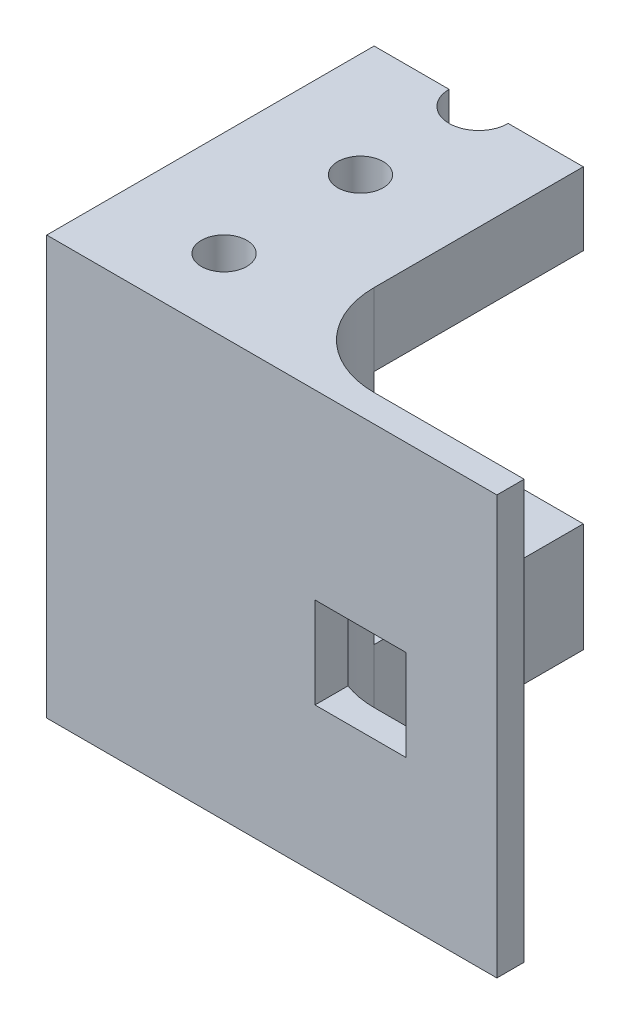
ISO-10303-21;
HEADER;
FILE_DESCRIPTION(('STEP AP214'),'2;1');
FILE_NAME('part.step','',(''),(''),'','','');
FILE_SCHEMA(('AUTOMOTIVE_DESIGN { 1 0 10303 214 1 1 1 1 }'));
ENDSEC;
DATA;
#1=APPLICATION_CONTEXT('core data for automotive mechanical design processes');
#2=APPLICATION_PROTOCOL_DEFINITION('international standard','automotive_design',2000,#1);
#3=PRODUCT_CONTEXT('',#1,'mechanical');
#4=PRODUCT('Part','Part','',(#3));
#5=PRODUCT_RELATED_PRODUCT_CATEGORY('part','',(#4));
#6=PRODUCT_DEFINITION_FORMATION('','',#4);
#7=PRODUCT_DEFINITION_CONTEXT('part definition',#1,'design');
#8=PRODUCT_DEFINITION('design','',#6,#7);
#9=PRODUCT_DEFINITION_SHAPE('','',#8);
#10=(LENGTH_UNIT() NAMED_UNIT(*) SI_UNIT(.MILLI.,.METRE.));
#11=(NAMED_UNIT(*) PLANE_ANGLE_UNIT() SI_UNIT($,.RADIAN.));
#12=(NAMED_UNIT(*) SI_UNIT($,.STERADIAN.) SOLID_ANGLE_UNIT());
#13=UNCERTAINTY_MEASURE_WITH_UNIT(LENGTH_MEASURE(1.E-05),#10,'distance_accuracy_value','');
#14=(GEOMETRIC_REPRESENTATION_CONTEXT(3) GLOBAL_UNCERTAINTY_ASSIGNED_CONTEXT((#13)) GLOBAL_UNIT_ASSIGNED_CONTEXT((#10,
#11,#12)) REPRESENTATION_CONTEXT('',''));
#15=CARTESIAN_POINT('',(0.,0.,0.));
#16=DIRECTION('',(0.,0.,1.));
#17=DIRECTION('',(1.,0.,0.));
#18=AXIS2_PLACEMENT_3D('',#15,#16,#17);
#19=CARTESIAN_POINT('',(11.5,46.,-16.5));
#20=DIRECTION('',(-1.,0.,0.));
#21=DIRECTION('',(0.,0.,1.));
#22=AXIS2_PLACEMENT_3D('',#19,#20,#21);
#23=PLANE('',#22);
#24=DIRECTION('',(0.,0.,-1.));
#25=VECTOR('',#24,1.);
#26=CARTESIAN_POINT('',(11.5,46.,-16.5));
#27=LINE('',#26,#25);
#28=CARTESIAN_POINT('',(11.5,46.,6.5));
#29=VERTEX_POINT('',#28);
#30=CARTESIAN_POINT('',(11.5,46.,-16.5));
#31=VERTEX_POINT('',#30);
#32=EDGE_CURVE('E289',#29,#31,#27,.T.);
#33=ORIENTED_EDGE('',*,*,#32,.F.);
#34=DIRECTION('',(0.,-1.,0.));
#35=VECTOR('',#34,1.);
#36=CARTESIAN_POINT('',(11.5,46.,6.5));
#37=LINE('',#36,#35);
#38=CARTESIAN_POINT('',(11.5,38.,6.50000000000002));
#39=VERTEX_POINT('',#38);
#40=EDGE_CURVE('E251',#29,#39,#37,.T.);
#41=ORIENTED_EDGE('',*,*,#40,.T.);
#42=DIRECTION('',(0.,0.,-1.));
#43=VECTOR('',#42,1.);
#44=CARTESIAN_POINT('',(11.5,38.,-16.5));
#45=LINE('',#44,#43);
#46=CARTESIAN_POINT('',(11.5,38.,-16.5));
#47=VERTEX_POINT('',#46);
#48=EDGE_CURVE('E463',#39,#47,#45,.T.);
#49=ORIENTED_EDGE('',*,*,#48,.T.);
#50=DIRECTION('',(0.,-1.,0.));
#51=VECTOR('',#50,1.);
#52=CARTESIAN_POINT('',(11.5,46.,-16.5));
#53=LINE('',#52,#51);
#54=EDGE_CURVE('E298',#31,#47,#53,.T.);
#55=ORIENTED_EDGE('',*,*,#54,.F.);
#56=EDGE_LOOP('',(#33,#41,#49,#55));
#57=FACE_BOUND('',#56,.T.);
#58=ADVANCED_FACE('F37',(#57),#23,.F.);
#59=CARTESIAN_POINT('',(-11.5,46.,-16.5));
#60=DIRECTION('',(0.,0.,1.));
#61=DIRECTION('',(1.,0.,0.));
#62=AXIS2_PLACEMENT_3D('',#59,#60,#61);
#63=PLANE('',#62);
#64=CARTESIAN_POINT('',(-8.,8.,-16.5));
#65=DIRECTION('',(0.,0.,-1.));
#66=DIRECTION('',(-1.,0.,0.));
#67=AXIS2_PLACEMENT_3D('',#64,#65,#66);
#68=CIRCLE('',#67,2.49999999999999);
#69=CARTESIAN_POINT('',(-10.5,8.,-16.5));
#70=VERTEX_POINT('',#69);
#71=EDGE_CURVE('E397',#70,#70,#68,.T.);
#72=ORIENTED_EDGE('',*,*,#71,.F.);
#73=EDGE_LOOP('',(#72));
#74=FACE_BOUND('',#73,.T.);
#75=DIRECTION('',(0.,-1.,0.));
#76=VECTOR('',#75,1.);
#77=CARTESIAN_POINT('',(-5.,0.,-16.5));
#78=LINE('',#77,#76);
#79=CARTESIAN_POINT('',(-5.,7.,-16.5));
#80=VERTEX_POINT('',#79);
#81=CARTESIAN_POINT('',(-5.,12.,-16.5));
#82=VERTEX_POINT('',#81);
#83=EDGE_CURVE('E226',#80,#82,#78,.F.);
#84=ORIENTED_EDGE('',*,*,#83,.F.);
#85=DIRECTION('',(-1.,0.,0.));
#86=VECTOR('',#85,1.);
#87=CARTESIAN_POINT('',(-11.5,7.,-16.5));
#88=LINE('',#87,#86);
#89=CARTESIAN_POINT('',(-3.25,7.,-16.5));
#90=VERTEX_POINT('',#89);
#91=EDGE_CURVE('E235',#90,#80,#88,.T.);
#92=ORIENTED_EDGE('',*,*,#91,.F.);
#93=DIRECTION('',(0.,-1.,0.));
#94=VECTOR('',#93,1.);
#95=CARTESIAN_POINT('',(-3.25,0.,-16.5));
#96=LINE('',#95,#94);
#97=CARTESIAN_POINT('',(-3.25,0.,-16.5));
#98=VERTEX_POINT('',#97);
#99=EDGE_CURVE('E362',#98,#90,#96,.F.);
#100=ORIENTED_EDGE('',*,*,#99,.F.);
#101=DIRECTION('',(-1.,0.,0.));
#102=VECTOR('',#101,1.);
#103=CARTESIAN_POINT('',(-11.5,0.,-16.5));
#104=LINE('',#103,#102);
#105=CARTESIAN_POINT('',(-11.5,0.,-16.5));
#106=VERTEX_POINT('',#105);
#107=EDGE_CURVE('E315',#98,#106,#104,.T.);
#108=ORIENTED_EDGE('',*,*,#107,.T.);
#109=DIRECTION('',(0.,-1.,0.));
#110=VECTOR('',#109,1.);
#111=CARTESIAN_POINT('',(-11.5,46.,-16.5));
#112=LINE('',#111,#110);
#113=CARTESIAN_POINT('',(-11.5,12.,-16.5));
#114=VERTEX_POINT('',#113);
#115=EDGE_CURVE('E312',#114,#106,#112,.T.);
#116=ORIENTED_EDGE('',*,*,#115,.F.);
#117=DIRECTION('',(-1.,0.,0.));
#118=VECTOR('',#117,1.);
#119=CARTESIAN_POINT('',(-11.5,12.,-16.5));
#120=LINE('',#119,#118);
#121=EDGE_CURVE('E473',#82,#114,#120,.T.);
#122=ORIENTED_EDGE('',*,*,#121,.F.);
#123=EDGE_LOOP('',(#84,#92,#100,#108,#116,#122));
#124=FACE_BOUND('',#123,.T.);
#125=ADVANCED_FACE('F484',(#74,#124),#63,.F.);
#126=CARTESIAN_POINT('',(8.,8.,-16.5));
#127=DIRECTION('',(0.,0.,-1.));
#128=DIRECTION('',(-1.,0.,0.));
#129=AXIS2_PLACEMENT_3D('',#126,#127,#128);
#130=CIRCLE('',#129,2.49999999999999);
#131=CARTESIAN_POINT('',(5.50000000000001,8.,-16.5));
#132=VERTEX_POINT('',#131);
#133=EDGE_CURVE('E391',#132,#132,#130,.T.);
#134=ORIENTED_EDGE('',*,*,#133,.F.);
#135=EDGE_LOOP('',(#134));
#136=FACE_BOUND('',#135,.T.);
#137=DIRECTION('',(0.,-1.,0.));
#138=VECTOR('',#137,1.);
#139=CARTESIAN_POINT('',(5.,0.,-16.5));
#140=LINE('',#139,#138);
#141=CARTESIAN_POINT('',(5.,12.,-16.5));
#142=VERTEX_POINT('',#141);
#143=CARTESIAN_POINT('',(5.,7.,-16.5));
#144=VERTEX_POINT('',#143);
#145=EDGE_CURVE('E215',#142,#144,#140,.T.);
#146=ORIENTED_EDGE('',*,*,#145,.F.);
#147=CARTESIAN_POINT('',(11.5,12.,-16.5));
#148=VERTEX_POINT('',#147);
#149=EDGE_CURVE('E460',#148,#142,#120,.T.);
#150=ORIENTED_EDGE('',*,*,#149,.F.);
#151=CARTESIAN_POINT('',(11.5,0.,-16.5));
#152=VERTEX_POINT('',#151);
#153=EDGE_CURVE('E320',#148,#152,#53,.T.);
#154=ORIENTED_EDGE('',*,*,#153,.T.);
#155=CARTESIAN_POINT('',(3.25,0.,-16.5));
#156=VERTEX_POINT('',#155);
#157=EDGE_CURVE('E304',#152,#156,#104,.T.);
#158=ORIENTED_EDGE('',*,*,#157,.T.);
#159=DIRECTION('',(0.,-1.,0.));
#160=VECTOR('',#159,1.);
#161=CARTESIAN_POINT('',(3.25,0.,-16.5));
#162=LINE('',#161,#160);
#163=CARTESIAN_POINT('',(3.25,7.,-16.5));
#164=VERTEX_POINT('',#163);
#165=EDGE_CURVE('E242',#164,#156,#162,.T.);
#166=ORIENTED_EDGE('',*,*,#165,.F.);
#167=EDGE_CURVE('E232',#144,#164,#88,.T.);
#168=ORIENTED_EDGE('',*,*,#167,.F.);
#169=EDGE_LOOP('',(#146,#150,#154,#158,#166,#168));
#170=FACE_BOUND('',#169,.T.);
#171=ADVANCED_FACE('F240',(#136,#170),#63,.F.);
#172=CARTESIAN_POINT('',(-8.,42.,-16.5));
#173=DIRECTION('',(0.,0.,-1.));
#174=DIRECTION('',(-1.,0.,0.));
#175=AXIS2_PLACEMENT_3D('',#172,#173,#174);
#176=CIRCLE('',#175,2.49999999999999);
#177=CARTESIAN_POINT('',(-10.5,42.,-16.5));
#178=VERTEX_POINT('',#177);
#179=EDGE_CURVE('E403',#178,#178,#176,.T.);
#180=ORIENTED_EDGE('',*,*,#179,.F.);
#181=EDGE_LOOP('',(#180));
#182=FACE_BOUND('',#181,.T.);
#183=DIRECTION('',(0.,-1.,0.));
#184=VECTOR('',#183,1.);
#185=CARTESIAN_POINT('',(-3.25,0.,-16.5));
#186=LINE('',#185,#184);
#187=CARTESIAN_POINT('',(-3.25,41.9999350812717,-16.5));
#188=VERTEX_POINT('',#187);
#189=CARTESIAN_POINT('',(-3.25,46.,-16.5));
#190=VERTEX_POINT('',#189);
#191=EDGE_CURVE('E366',#188,#190,#186,.F.);
#192=ORIENTED_EDGE('',*,*,#191,.F.);
#193=DIRECTION('',(1.,0.,0.));
#194=VECTOR('',#193,1.);
#195=CARTESIAN_POINT('',(-11.5,41.9999350812717,-16.5));
#196=LINE('',#195,#194);
#197=CARTESIAN_POINT('',(-5.,41.9999350812717,-16.5));
#198=VERTEX_POINT('',#197);
#199=EDGE_CURVE('E243',#198,#188,#196,.T.);
#200=ORIENTED_EDGE('',*,*,#199,.F.);
#201=DIRECTION('',(0.,-1.,0.));
#202=VECTOR('',#201,1.);
#203=CARTESIAN_POINT('',(-5.,0.,-16.5));
#204=LINE('',#203,#202);
#205=CARTESIAN_POINT('',(-5.,38.,-16.5));
#206=VERTEX_POINT('',#205);
#207=EDGE_CURVE('E350',#206,#198,#204,.F.);
#208=ORIENTED_EDGE('',*,*,#207,.F.);
#209=DIRECTION('',(-1.,0.,0.));
#210=VECTOR('',#209,1.);
#211=CARTESIAN_POINT('',(-11.5,38.,-16.5));
#212=LINE('',#211,#210);
#213=CARTESIAN_POINT('',(-11.5,38.,-16.5));
#214=VERTEX_POINT('',#213);
#215=EDGE_CURVE('E465',#206,#214,#212,.T.);
#216=ORIENTED_EDGE('',*,*,#215,.T.);
#217=CARTESIAN_POINT('',(-11.5,46.,-16.5));
#218=VERTEX_POINT('',#217);
#219=EDGE_CURVE('E317',#218,#214,#112,.T.);
#220=ORIENTED_EDGE('',*,*,#219,.F.);
#221=DIRECTION('',(-1.,0.,0.));
#222=VECTOR('',#221,1.);
#223=CARTESIAN_POINT('',(-11.5,46.,-16.5));
#224=LINE('',#223,#222);
#225=EDGE_CURVE('E299',#190,#218,#224,.T.);
#226=ORIENTED_EDGE('',*,*,#225,.F.);
#227=EDGE_LOOP('',(#192,#200,#208,#216,#220,#226));
#228=FACE_BOUND('',#227,.T.);
#229=ADVANCED_FACE('F542',(#182,#228),#63,.F.);
#230=CARTESIAN_POINT('',(8.,42.,-16.5));
#231=DIRECTION('',(0.,0.,-1.));
#232=DIRECTION('',(-1.,0.,0.));
#233=AXIS2_PLACEMENT_3D('',#230,#231,#232);
#234=CIRCLE('',#233,2.49999999999999);
#235=CARTESIAN_POINT('',(5.50000000000001,42.,-16.5));
#236=VERTEX_POINT('',#235);
#237=EDGE_CURVE('E385',#236,#236,#234,.T.);
#238=ORIENTED_EDGE('',*,*,#237,.F.);
#239=EDGE_LOOP('',(#238));
#240=FACE_BOUND('',#239,.T.);
#241=DIRECTION('',(0.,-1.,0.));
#242=VECTOR('',#241,1.);
#243=CARTESIAN_POINT('',(3.25,0.,-16.5));
#244=LINE('',#243,#242);
#245=CARTESIAN_POINT('',(3.25,46.,-16.5));
#246=VERTEX_POINT('',#245);
#247=CARTESIAN_POINT('',(3.25,41.9999350812717,-16.5));
#248=VERTEX_POINT('',#247);
#249=EDGE_CURVE('E364',#246,#248,#244,.T.);
#250=ORIENTED_EDGE('',*,*,#249,.F.);
#251=EDGE_CURVE('E302',#31,#246,#224,.T.);
#252=ORIENTED_EDGE('',*,*,#251,.F.);
#253=ORIENTED_EDGE('',*,*,#54,.T.);
#254=CARTESIAN_POINT('',(5.,38.,-16.5));
#255=VERTEX_POINT('',#254);
#256=EDGE_CURVE('E354',#47,#255,#212,.T.);
#257=ORIENTED_EDGE('',*,*,#256,.T.);
#258=DIRECTION('',(0.,-1.,0.));
#259=VECTOR('',#258,1.);
#260=CARTESIAN_POINT('',(5.,0.,-16.5));
#261=LINE('',#260,#259);
#262=CARTESIAN_POINT('',(5.,41.9999350812717,-16.5));
#263=VERTEX_POINT('',#262);
#264=EDGE_CURVE('E347',#263,#255,#261,.T.);
#265=ORIENTED_EDGE('',*,*,#264,.F.);
#266=EDGE_CURVE('E246',#248,#263,#196,.T.);
#267=ORIENTED_EDGE('',*,*,#266,.F.);
#268=EDGE_LOOP('',(#250,#252,#253,#257,#265,#267));
#269=FACE_BOUND('',#268,.T.);
#270=ADVANCED_FACE('F353',(#240,#269),#63,.F.);
#271=DIRECTION('',(0.,0.,-1.));
#272=VECTOR('',#271,1.);
#273=CARTESIAN_POINT('',(11.5,12.,-16.5));
#274=LINE('',#273,#272);
#275=CARTESIAN_POINT('',(11.5,12.,6.50000000000002));
#276=VERTEX_POINT('',#275);
#277=EDGE_CURVE('E472',#276,#148,#274,.T.);
#278=ORIENTED_EDGE('',*,*,#277,.F.);
#279=DIRECTION('',(0.,-1.,0.));
#280=VECTOR('',#279,1.);
#281=CARTESIAN_POINT('',(11.5,46.,6.5));
#282=LINE('',#281,#280);
#283=CARTESIAN_POINT('',(11.5,0.,6.49999999999999));
#284=VERTEX_POINT('',#283);
#285=EDGE_CURVE('E245',#276,#284,#282,.T.);
#286=ORIENTED_EDGE('',*,*,#285,.T.);
#287=DIRECTION('',(0.,0.,-1.));
#288=VECTOR('',#287,1.);
#289=CARTESIAN_POINT('',(11.5,0.,-16.5));
#290=LINE('',#289,#288);
#291=EDGE_CURVE('E313',#284,#152,#290,.T.);
#292=ORIENTED_EDGE('',*,*,#291,.T.);
#293=ORIENTED_EDGE('',*,*,#153,.F.);
#294=EDGE_LOOP('',(#278,#286,#292,#293));
#295=FACE_BOUND('',#294,.T.);
#296=ADVANCED_FACE('F529',(#295),#23,.F.);
#297=CARTESIAN_POINT('',(-11.5,46.,-16.5));
#298=DIRECTION('',(1.,0.,0.));
#299=DIRECTION('',(0.,0.,-1.));
#300=AXIS2_PLACEMENT_3D('',#297,#298,#299);
#301=PLANE('',#300);
#302=ORIENTED_EDGE('',*,*,#219,.T.);
#303=DIRECTION('',(0.,0.,1.));
#304=VECTOR('',#303,1.);
#305=CARTESIAN_POINT('',(-11.5,38.,-16.5));
#306=LINE('',#305,#304);
#307=CARTESIAN_POINT('',(-11.5,38.,0.500000000000007));
#308=VERTEX_POINT('',#307);
#309=EDGE_CURVE('E456',#214,#308,#306,.T.);
#310=ORIENTED_EDGE('',*,*,#309,.T.);
#311=DIRECTION('',(0.,-1.,0.));
#312=VECTOR('',#311,1.);
#313=CARTESIAN_POINT('',(-11.5,38.,0.500000000000007));
#314=LINE('',#313,#312);
#315=CARTESIAN_POINT('',(-11.5,12.,0.500000000000007));
#316=VERTEX_POINT('',#315);
#317=EDGE_CURVE('E307',#308,#316,#314,.T.);
#318=ORIENTED_EDGE('',*,*,#317,.T.);
#319=DIRECTION('',(0.,0.,1.));
#320=VECTOR('',#319,1.);
#321=CARTESIAN_POINT('',(-11.5,12.,-16.5));
#322=LINE('',#321,#320);
#323=EDGE_CURVE('E453',#114,#316,#322,.T.);
#324=ORIENTED_EDGE('',*,*,#323,.F.);
#325=ORIENTED_EDGE('',*,*,#115,.T.);
#326=DIRECTION('',(0.,0.,1.));
#327=VECTOR('',#326,1.);
#328=CARTESIAN_POINT('',(-11.5,0.,-16.5));
#329=LINE('',#328,#327);
#330=CARTESIAN_POINT('',(-11.5,0.,19.5));
#331=VERTEX_POINT('',#330);
#332=EDGE_CURVE('E300',#106,#331,#329,.T.);
#333=ORIENTED_EDGE('',*,*,#332,.T.);
#334=DIRECTION('',(0.,-1.,0.));
#335=VECTOR('',#334,1.);
#336=CARTESIAN_POINT('',(-11.5,46.,19.5));
#337=LINE('',#336,#335);
#338=CARTESIAN_POINT('',(-11.5,46.,19.5));
#339=VERTEX_POINT('',#338);
#340=EDGE_CURVE('E421',#339,#331,#337,.T.);
#341=ORIENTED_EDGE('',*,*,#340,.F.);
#342=DIRECTION('',(0.,0.,1.));
#343=VECTOR('',#342,1.);
#344=CARTESIAN_POINT('',(-11.5,46.,-16.5));
#345=LINE('',#344,#343);
#346=EDGE_CURVE('E310',#218,#339,#345,.T.);
#347=ORIENTED_EDGE('',*,*,#346,.F.);
#348=EDGE_LOOP('',(#302,#310,#318,#324,#325,#333,#341,#347));
#349=FACE_BOUND('',#348,.T.);
#350=ADVANCED_FACE('F481',(#349),#301,.F.);
#351=CARTESIAN_POINT('',(0.,46.,0.));
#352=DIRECTION('',(0.,1.,0.));
#353=DIRECTION('',(0.,0.,1.));
#354=AXIS2_PLACEMENT_3D('',#351,#352,#353);
#355=PLANE('',#354);
#356=CARTESIAN_POINT('',(0.,46.,-3.49999999999999));
#357=DIRECTION('',(0.,1.,0.));
#358=DIRECTION('',(0.,0.,1.));
#359=AXIS2_PLACEMENT_3D('',#356,#357,#358);
#360=CIRCLE('',#359,2.5);
#361=CARTESIAN_POINT('',(0.,46.,-0.999999999999991));
#362=VERTEX_POINT('',#361);
#363=EDGE_CURVE('E441',#362,#362,#360,.T.);
#364=ORIENTED_EDGE('',*,*,#363,.F.);
#365=EDGE_LOOP('',(#364));
#366=FACE_BOUND('',#365,.T.);
#367=CARTESIAN_POINT('',(0.,46.,11.5));
#368=DIRECTION('',(0.,1.,0.));
#369=DIRECTION('',(0.,0.,1.));
#370=AXIS2_PLACEMENT_3D('',#367,#368,#369);
#371=CIRCLE('',#370,2.5);
#372=CARTESIAN_POINT('',(0.,46.,14.));
#373=VERTEX_POINT('',#372);
#374=EDGE_CURVE('E447',#373,#373,#371,.T.);
#375=ORIENTED_EDGE('',*,*,#374,.F.);
#376=EDGE_LOOP('',(#375));
#377=FACE_BOUND('',#376,.T.);
#378=ORIENTED_EDGE('',*,*,#251,.T.);
#379=CARTESIAN_POINT('',(0.,46.,-16.5));
#380=DIRECTION('',(0.,-1.,0.));
#381=DIRECTION('',(0.,0.,-1.));
#382=AXIS2_PLACEMENT_3D('',#379,#380,#381);
#383=CIRCLE('',#382,3.25);
#384=EDGE_CURVE('E227',#246,#190,#383,.T.);
#385=ORIENTED_EDGE('',*,*,#384,.T.);
#386=ORIENTED_EDGE('',*,*,#225,.T.);
#387=ORIENTED_EDGE('',*,*,#346,.T.);
#388=DIRECTION('',(1.,0.,0.));
#389=VECTOR('',#388,1.);
#390=CARTESIAN_POINT('',(-11.5,46.,19.5));
#391=LINE('',#390,#389);
#392=CARTESIAN_POINT('',(38.,46.,19.5));
#393=VERTEX_POINT('',#392);
#394=EDGE_CURVE('E429',#339,#393,#391,.T.);
#395=ORIENTED_EDGE('',*,*,#394,.T.);
#396=DIRECTION('',(0.,0.,1.));
#397=VECTOR('',#396,1.);
#398=CARTESIAN_POINT('',(38.,46.,16.5));
#399=LINE('',#398,#397);
#400=CARTESIAN_POINT('',(38.,46.,16.5));
#401=VERTEX_POINT('',#400);
#402=EDGE_CURVE('E412',#401,#393,#399,.T.);
#403=ORIENTED_EDGE('',*,*,#402,.F.);
#404=DIRECTION('',(1.,0.,0.));
#405=VECTOR('',#404,1.);
#406=CARTESIAN_POINT('',(-11.5,46.,16.5));
#407=LINE('',#406,#405);
#408=CARTESIAN_POINT('',(21.5,46.,16.5));
#409=VERTEX_POINT('',#408);
#410=EDGE_CURVE('E292',#409,#401,#407,.T.);
#411=ORIENTED_EDGE('',*,*,#410,.F.);
#412=CARTESIAN_POINT('',(21.5,46.,6.5));
#413=DIRECTION('',(0.,1.,0.));
#414=DIRECTION('',(0.,0.,1.));
#415=AXIS2_PLACEMENT_3D('',#412,#413,#414);
#416=CIRCLE('',#415,10.);
#417=EDGE_CURVE('E11',#409,#29,#416,.F.);
#418=ORIENTED_EDGE('',*,*,#417,.T.);
#419=ORIENTED_EDGE('',*,*,#32,.T.);
#420=EDGE_LOOP('',(#378,#385,#386,#387,#395,#403,#411,#418,#419));
#421=FACE_BOUND('',#420,.T.);
#422=ADVANCED_FACE('F288',(#366,#377,#421),#355,.T.);
#423=CARTESIAN_POINT('',(0.,0.,0.));
#424=DIRECTION('',(0.,1.,0.));
#425=DIRECTION('',(0.,0.,1.));
#426=AXIS2_PLACEMENT_3D('',#423,#424,#425);
#427=PLANE('',#426);
#428=CARTESIAN_POINT('',(0.,0.,-16.5));
#429=DIRECTION('',(0.,-1.,0.));
#430=DIRECTION('',(0.,0.,-1.));
#431=AXIS2_PLACEMENT_3D('',#428,#429,#430);
#432=CIRCLE('',#431,3.25);
#433=EDGE_CURVE('E492',#156,#98,#432,.T.);
#434=ORIENTED_EDGE('',*,*,#433,.F.);
#435=ORIENTED_EDGE('',*,*,#157,.F.);
#436=ORIENTED_EDGE('',*,*,#291,.F.);
#437=CARTESIAN_POINT('',(21.5,0.,6.49999999999999));
#438=DIRECTION('',(0.,1.,0.));
#439=DIRECTION('',(0.,0.,1.));
#440=AXIS2_PLACEMENT_3D('',#437,#438,#439);
#441=CIRCLE('',#440,10.);
#442=CARTESIAN_POINT('',(21.5,0.,16.5));
#443=VERTEX_POINT('',#442);
#444=EDGE_CURVE('E258',#284,#443,#441,.T.);
#445=ORIENTED_EDGE('',*,*,#444,.T.);
#446=DIRECTION('',(1.,0.,0.));
#447=VECTOR('',#446,1.);
#448=CARTESIAN_POINT('',(-11.5,0.,16.5));
#449=LINE('',#448,#447);
#450=CARTESIAN_POINT('',(38.,0.,16.5));
#451=VERTEX_POINT('',#450);
#452=EDGE_CURVE('E424',#443,#451,#449,.T.);
#453=ORIENTED_EDGE('',*,*,#452,.T.);
#454=DIRECTION('',(0.,0.,-1.));
#455=VECTOR('',#454,1.);
#456=CARTESIAN_POINT('',(38.,0.,16.5));
#457=LINE('',#456,#455);
#458=CARTESIAN_POINT('',(38.,0.,19.5));
#459=VERTEX_POINT('',#458);
#460=EDGE_CURVE('E418',#459,#451,#457,.T.);
#461=ORIENTED_EDGE('',*,*,#460,.F.);
#462=DIRECTION('',(1.,0.,0.));
#463=VECTOR('',#462,1.);
#464=CARTESIAN_POINT('',(-11.5,0.,19.5));
#465=LINE('',#464,#463);
#466=EDGE_CURVE('E427',#331,#459,#465,.T.);
#467=ORIENTED_EDGE('',*,*,#466,.F.);
#468=ORIENTED_EDGE('',*,*,#332,.F.);
#469=ORIENTED_EDGE('',*,*,#107,.F.);
#470=EDGE_LOOP('',(#434,#435,#436,#445,#453,#461,#467,#468,#469));
#471=FACE_BOUND('',#470,.T.);
#472=CARTESIAN_POINT('',(0.,0.,11.5));
#473=DIRECTION('',(0.,-1.,0.));
#474=DIRECTION('',(0.,0.,-1.));
#475=AXIS2_PLACEMENT_3D('',#472,#473,#474);
#476=CIRCLE('',#475,2.5);
#477=CARTESIAN_POINT('',(0.,0.,9.00000000000001));
#478=VERTEX_POINT('',#477);
#479=EDGE_CURVE('E426',#478,#478,#476,.T.);
#480=ORIENTED_EDGE('',*,*,#479,.F.);
#481=EDGE_LOOP('',(#480));
#482=FACE_BOUND('',#481,.T.);
#483=CARTESIAN_POINT('',(0.,0.,-3.49999999999999));
#484=DIRECTION('',(0.,-1.,0.));
#485=DIRECTION('',(0.,0.,-1.));
#486=AXIS2_PLACEMENT_3D('',#483,#484,#485);
#487=CIRCLE('',#486,2.5);
#488=CARTESIAN_POINT('',(0.,0.,-5.99999999999999));
#489=VERTEX_POINT('',#488);
#490=EDGE_CURVE('E435',#489,#489,#487,.T.);
#491=ORIENTED_EDGE('',*,*,#490,.F.);
#492=EDGE_LOOP('',(#491));
#493=FACE_BOUND('',#492,.T.);
#494=ADVANCED_FACE('F489',(#471,#482,#493),#427,.F.);
#495=CARTESIAN_POINT('',(-11.5,38.,0.500000000000007));
#496=DIRECTION('',(0.,0.,-1.));
#497=DIRECTION('',(-1.,0.,0.));
#498=AXIS2_PLACEMENT_3D('',#495,#496,#497);
#499=PLANE('',#498);
#500=DIRECTION('',(1.,0.,0.));
#501=VECTOR('',#500,1.);
#502=CARTESIAN_POINT('',(-11.5,38.,0.500000000000007));
#503=LINE('',#502,#501);
#504=CARTESIAN_POINT('',(5.50000000000002,38.,0.500000000000007));
#505=VERTEX_POINT('',#504);
#506=EDGE_CURVE('E459',#308,#505,#503,.T.);
#507=ORIENTED_EDGE('',*,*,#506,.T.);
#508=DIRECTION('',(0.,-1.,0.));
#509=VECTOR('',#508,1.);
#510=CARTESIAN_POINT('',(5.50000000000002,12.,0.500000000000007));
#511=LINE('',#510,#509);
#512=CARTESIAN_POINT('',(5.50000000000002,12.,0.500000000000007));
#513=VERTEX_POINT('',#512);
#514=EDGE_CURVE('E322',#505,#513,#511,.T.);
#515=ORIENTED_EDGE('',*,*,#514,.T.);
#516=DIRECTION('',(1.,0.,0.));
#517=VECTOR('',#516,1.);
#518=CARTESIAN_POINT('',(-11.5,12.,0.500000000000007));
#519=LINE('',#518,#517);
#520=EDGE_CURVE('E469',#316,#513,#519,.T.);
#521=ORIENTED_EDGE('',*,*,#520,.F.);
#522=ORIENTED_EDGE('',*,*,#317,.F.);
#523=EDGE_LOOP('',(#507,#515,#521,#522));
#524=FACE_BOUND('',#523,.T.);
#525=ADVANCED_FACE('F556',(#524),#499,.T.);
#526=CARTESIAN_POINT('',(0.,38.,0.));
#527=DIRECTION('',(0.,1.,0.));
#528=DIRECTION('',(0.,0.,1.));
#529=AXIS2_PLACEMENT_3D('',#526,#527,#528);
#530=PLANE('',#529);
#531=CARTESIAN_POINT('',(0.,38.,-16.5));
#532=DIRECTION('',(0.,1.,0.));
#533=DIRECTION('',(0.,0.,1.));
#534=AXIS2_PLACEMENT_3D('',#531,#532,#533);
#535=CIRCLE('',#534,5.);
#536=EDGE_CURVE('E355',#255,#206,#535,.F.);
#537=ORIENTED_EDGE('',*,*,#536,.F.);
#538=ORIENTED_EDGE('',*,*,#256,.F.);
#539=ORIENTED_EDGE('',*,*,#48,.F.);
#540=DIRECTION('',(-0.707106781186546,0.,-0.707106781186549));
#541=VECTOR('',#540,1.);
#542=CARTESIAN_POINT('',(2.50000000000001,38.,-2.5));
#543=LINE('',#542,#541);
#544=EDGE_CURVE('E330',#39,#505,#543,.T.);
#545=ORIENTED_EDGE('',*,*,#544,.T.);
#546=ORIENTED_EDGE('',*,*,#506,.F.);
#547=ORIENTED_EDGE('',*,*,#309,.F.);
#548=ORIENTED_EDGE('',*,*,#215,.F.);
#549=EDGE_LOOP('',(#537,#538,#539,#545,#546,#547,#548));
#550=FACE_BOUND('',#549,.T.);
#551=ADVANCED_FACE('F553',(#550),#530,.F.);
#552=CARTESIAN_POINT('',(0.,12.,0.));
#553=DIRECTION('',(0.,1.,0.));
#554=DIRECTION('',(0.,0.,1.));
#555=AXIS2_PLACEMENT_3D('',#552,#553,#554);
#556=PLANE('',#555);
#557=ORIENTED_EDGE('',*,*,#149,.T.);
#558=CARTESIAN_POINT('',(0.,12.,-16.5));
#559=DIRECTION('',(0.,1.,0.));
#560=DIRECTION('',(0.,0.,1.));
#561=AXIS2_PLACEMENT_3D('',#558,#559,#560);
#562=CIRCLE('',#561,5.);
#563=EDGE_CURVE('E221',#142,#82,#562,.F.);
#564=ORIENTED_EDGE('',*,*,#563,.T.);
#565=ORIENTED_EDGE('',*,*,#121,.T.);
#566=ORIENTED_EDGE('',*,*,#323,.T.);
#567=ORIENTED_EDGE('',*,*,#520,.T.);
#568=DIRECTION('',(0.707106781186546,0.,0.707106781186549));
#569=VECTOR('',#568,1.);
#570=CARTESIAN_POINT('',(5.50000000000002,12.,0.500000000000007));
#571=LINE('',#570,#569);
#572=EDGE_CURVE('E327',#513,#276,#571,.T.);
#573=ORIENTED_EDGE('',*,*,#572,.T.);
#574=ORIENTED_EDGE('',*,*,#277,.T.);
#575=EDGE_LOOP('',(#557,#564,#565,#566,#567,#573,#574));
#576=FACE_BOUND('',#575,.T.);
#577=ADVANCED_FACE('F475',(#576),#556,.T.);
#578=CARTESIAN_POINT('',(0.,40.,11.5));
#579=DIRECTION('',(0.,1.,0.));
#580=DIRECTION('',(0.,0.,1.));
#581=AXIS2_PLACEMENT_3D('',#578,#579,#580);
#582=CYLINDRICAL_SURFACE('',#581,2.5);
#583=CARTESIAN_POINT('',(0.,40.,11.5));
#584=DIRECTION('',(0.,1.,0.));
#585=DIRECTION('',(0.,0.,1.));
#586=AXIS2_PLACEMENT_3D('',#583,#584,#585);
#587=CIRCLE('',#586,2.5);
#588=CARTESIAN_POINT('',(0.,40.,14.));
#589=VERTEX_POINT('',#588);
#590=EDGE_CURVE('E450',#589,#589,#587,.T.);
#591=ORIENTED_EDGE('',*,*,#590,.F.);
#592=EDGE_LOOP('',(#591));
#593=FACE_BOUND('',#592,.T.);
#594=ORIENTED_EDGE('',*,*,#374,.T.);
#595=EDGE_LOOP('',(#594));
#596=FACE_BOUND('',#595,.T.);
#597=ADVANCED_FACE('F647',(#593,#596),#582,.F.);
#598=CARTESIAN_POINT('',(0.,40.,11.5));
#599=DIRECTION('',(0.,1.,0.));
#600=DIRECTION('',(0.,0.,1.));
#601=AXIS2_PLACEMENT_3D('',#598,#599,#600);
#602=PLANE('',#601);
#603=ORIENTED_EDGE('',*,*,#590,.T.);
#604=EDGE_LOOP('',(#603));
#605=FACE_BOUND('',#604,.T.);
#606=ADVANCED_FACE('F743',(#605),#602,.T.);
#607=CARTESIAN_POINT('',(0.,40.,-3.49999999999999));
#608=DIRECTION('',(0.,1.,0.));
#609=DIRECTION('',(0.,0.,1.));
#610=AXIS2_PLACEMENT_3D('',#607,#608,#609);
#611=CYLINDRICAL_SURFACE('',#610,2.5);
#612=CARTESIAN_POINT('',(0.,40.,-3.49999999999999));
#613=DIRECTION('',(0.,1.,0.));
#614=DIRECTION('',(0.,0.,1.));
#615=AXIS2_PLACEMENT_3D('',#612,#613,#614);
#616=CIRCLE('',#615,2.5);
#617=CARTESIAN_POINT('',(0.,40.,-0.999999999999991));
#618=VERTEX_POINT('',#617);
#619=EDGE_CURVE('E444',#618,#618,#616,.T.);
#620=ORIENTED_EDGE('',*,*,#619,.F.);
#621=EDGE_LOOP('',(#620));
#622=FACE_BOUND('',#621,.T.);
#623=ORIENTED_EDGE('',*,*,#363,.T.);
#624=EDGE_LOOP('',(#623));
#625=FACE_BOUND('',#624,.T.);
#626=ADVANCED_FACE('F747',(#622,#625),#611,.F.);
#627=CARTESIAN_POINT('',(0.,40.,-3.49999999999999));
#628=DIRECTION('',(0.,1.,0.));
#629=DIRECTION('',(0.,0.,1.));
#630=AXIS2_PLACEMENT_3D('',#627,#628,#629);
#631=PLANE('',#630);
#632=ORIENTED_EDGE('',*,*,#619,.T.);
#633=EDGE_LOOP('',(#632));
#634=FACE_BOUND('',#633,.T.);
#635=ADVANCED_FACE('F751',(#634),#631,.T.);
#636=CARTESIAN_POINT('',(0.,6.,-3.49999999999999));
#637=DIRECTION('',(0.,-1.,0.));
#638=DIRECTION('',(0.,0.,-1.));
#639=AXIS2_PLACEMENT_3D('',#636,#637,#638);
#640=CYLINDRICAL_SURFACE('',#639,2.5);
#641=CARTESIAN_POINT('',(0.,6.,-3.49999999999999));
#642=DIRECTION('',(0.,-1.,0.));
#643=DIRECTION('',(0.,0.,-1.));
#644=AXIS2_PLACEMENT_3D('',#641,#642,#643);
#645=CIRCLE('',#644,2.5);
#646=CARTESIAN_POINT('',(0.,6.,-5.99999999999999));
#647=VERTEX_POINT('',#646);
#648=EDGE_CURVE('E438',#647,#647,#645,.T.);
#649=ORIENTED_EDGE('',*,*,#648,.F.);
#650=EDGE_LOOP('',(#649));
#651=FACE_BOUND('',#650,.T.);
#652=ORIENTED_EDGE('',*,*,#490,.T.);
#653=EDGE_LOOP('',(#652));
#654=FACE_BOUND('',#653,.T.);
#655=ADVANCED_FACE('F755',(#651,#654),#640,.F.);
#656=CARTESIAN_POINT('',(0.,6.,-3.49999999999999));
#657=DIRECTION('',(0.,-1.,0.));
#658=DIRECTION('',(0.,0.,-1.));
#659=AXIS2_PLACEMENT_3D('',#656,#657,#658);
#660=PLANE('',#659);
#661=ORIENTED_EDGE('',*,*,#648,.T.);
#662=EDGE_LOOP('',(#661));
#663=FACE_BOUND('',#662,.T.);
#664=ADVANCED_FACE('F759',(#663),#660,.T.);
#665=CARTESIAN_POINT('',(0.,6.,11.5));
#666=DIRECTION('',(0.,-1.,0.));
#667=DIRECTION('',(0.,0.,-1.));
#668=AXIS2_PLACEMENT_3D('',#665,#666,#667);
#669=CYLINDRICAL_SURFACE('',#668,2.5);
#670=CARTESIAN_POINT('',(0.,6.,11.5));
#671=DIRECTION('',(0.,-1.,0.));
#672=DIRECTION('',(0.,0.,-1.));
#673=AXIS2_PLACEMENT_3D('',#670,#671,#672);
#674=CIRCLE('',#673,2.5);
#675=CARTESIAN_POINT('',(0.,6.,9.00000000000001));
#676=VERTEX_POINT('',#675);
#677=EDGE_CURVE('E432',#676,#676,#674,.T.);
#678=ORIENTED_EDGE('',*,*,#677,.F.);
#679=EDGE_LOOP('',(#678));
#680=FACE_BOUND('',#679,.T.);
#681=ORIENTED_EDGE('',*,*,#479,.T.);
#682=EDGE_LOOP('',(#681));
#683=FACE_BOUND('',#682,.T.);
#684=ADVANCED_FACE('F763',(#680,#683),#669,.F.);
#685=CARTESIAN_POINT('',(0.,6.,11.5));
#686=DIRECTION('',(0.,-1.,0.));
#687=DIRECTION('',(0.,0.,-1.));
#688=AXIS2_PLACEMENT_3D('',#685,#686,#687);
#689=PLANE('',#688);
#690=ORIENTED_EDGE('',*,*,#677,.T.);
#691=EDGE_LOOP('',(#690));
#692=FACE_BOUND('',#691,.T.);
#693=ADVANCED_FACE('F636',(#692),#689,.T.);
#694=CARTESIAN_POINT('',(5.50000000000002,38.,0.500000000000007));
#695=DIRECTION('',(0.707106781186549,0.,-0.707106781186546));
#696=DIRECTION('',(0.,1.,0.));
#697=AXIS2_PLACEMENT_3D('',#694,#695,#696);
#698=PLANE('',#697);
#699=ORIENTED_EDGE('',*,*,#544,.F.);
#700=DIRECTION('',(0.,1.,0.));
#701=VECTOR('',#700,1.);
#702=CARTESIAN_POINT('',(11.5,38.,6.50000000000002));
#703=LINE('',#702,#701);
#704=EDGE_CURVE('E325',#276,#39,#703,.T.);
#705=ORIENTED_EDGE('',*,*,#704,.F.);
#706=ORIENTED_EDGE('',*,*,#572,.F.);
#707=ORIENTED_EDGE('',*,*,#514,.F.);
#708=EDGE_LOOP('',(#699,#705,#706,#707));
#709=FACE_BOUND('',#708,.T.);
#710=ADVANCED_FACE('F551',(#709),#698,.T.);
#711=CARTESIAN_POINT('',(-11.5,46.,16.5));
#712=DIRECTION('',(0.,0.,-1.));
#713=DIRECTION('',(-1.,0.,0.));
#714=AXIS2_PLACEMENT_3D('',#711,#712,#713);
#715=PLANE('',#714);
#716=ORIENTED_EDGE('',*,*,#452,.F.);
#717=DIRECTION('',(0.,-1.,0.));
#718=VECTOR('',#717,1.);
#719=CARTESIAN_POINT('',(21.5,46.,16.5));
#720=LINE('',#719,#718);
#721=CARTESIAN_POINT('',(21.5,16.,16.5));
#722=VERTEX_POINT('',#721);
#723=EDGE_CURVE('E256',#443,#722,#720,.F.);
#724=ORIENTED_EDGE('',*,*,#723,.T.);
#725=DIRECTION('',(-1.,0.,0.));
#726=VECTOR('',#725,1.);
#727=CARTESIAN_POINT('',(-11.5,16.,16.5));
#728=LINE('',#727,#726);
#729=CARTESIAN_POINT('',(28.,16.,16.5));
#730=VERTEX_POINT('',#729);
#731=EDGE_CURVE('E279',#730,#722,#728,.T.);
#732=ORIENTED_EDGE('',*,*,#731,.F.);
#733=DIRECTION('',(0.,-1.,0.));
#734=VECTOR('',#733,1.);
#735=CARTESIAN_POINT('',(28.,46.,16.5));
#736=LINE('',#735,#734);
#737=CARTESIAN_POINT('',(28.,26.,16.5));
#738=VERTEX_POINT('',#737);
#739=EDGE_CURVE('E278',#738,#730,#736,.T.);
#740=ORIENTED_EDGE('',*,*,#739,.F.);
#741=DIRECTION('',(1.,0.,0.));
#742=VECTOR('',#741,1.);
#743=CARTESIAN_POINT('',(-11.5,26.,16.5));
#744=LINE('',#743,#742);
#745=CARTESIAN_POINT('',(21.5,26.,16.5));
#746=VERTEX_POINT('',#745);
#747=EDGE_CURVE('E267',#746,#738,#744,.T.);
#748=ORIENTED_EDGE('',*,*,#747,.F.);
#749=DIRECTION('',(0.,-1.,0.));
#750=VECTOR('',#749,1.);
#751=CARTESIAN_POINT('',(21.5,46.,16.5));
#752=LINE('',#751,#750);
#753=EDGE_CURVE('E254',#746,#409,#752,.F.);
#754=ORIENTED_EDGE('',*,*,#753,.T.);
#755=ORIENTED_EDGE('',*,*,#410,.T.);
#756=DIRECTION('',(0.,1.,0.));
#757=VECTOR('',#756,1.);
#758=CARTESIAN_POINT('',(38.,46.,16.5));
#759=LINE('',#758,#757);
#760=EDGE_CURVE('E409',#451,#401,#759,.T.);
#761=ORIENTED_EDGE('',*,*,#760,.F.);
#762=EDGE_LOOP('',(#716,#724,#732,#740,#748,#754,#755,#761));
#763=FACE_BOUND('',#762,.T.);
#764=ADVANCED_FACE('F275',(#763),#715,.T.);
#765=CARTESIAN_POINT('',(-11.5,46.,19.5));
#766=DIRECTION('',(0.,0.,1.));
#767=DIRECTION('',(1.,0.,0.));
#768=AXIS2_PLACEMENT_3D('',#765,#766,#767);
#769=PLANE('',#768);
#770=DIRECTION('',(0.,1.,0.));
#771=VECTOR('',#770,1.);
#772=CARTESIAN_POINT('',(28.,26.,19.5));
#773=LINE('',#772,#771);
#774=CARTESIAN_POINT('',(28.,16.,19.5));
#775=VERTEX_POINT('',#774);
#776=CARTESIAN_POINT('',(28.,26.,19.5));
#777=VERTEX_POINT('',#776);
#778=EDGE_CURVE('E368',#775,#777,#773,.T.);
#779=ORIENTED_EDGE('',*,*,#778,.F.);
#780=DIRECTION('',(1.,0.,0.));
#781=VECTOR('',#780,1.);
#782=CARTESIAN_POINT('',(18.,16.,19.5));
#783=LINE('',#782,#781);
#784=CARTESIAN_POINT('',(18.,16.,19.5));
#785=VERTEX_POINT('',#784);
#786=EDGE_CURVE('E374',#785,#775,#783,.T.);
#787=ORIENTED_EDGE('',*,*,#786,.F.);
#788=DIRECTION('',(0.,-1.,0.));
#789=VECTOR('',#788,1.);
#790=CARTESIAN_POINT('',(18.,26.,19.5));
#791=LINE('',#790,#789);
#792=CARTESIAN_POINT('',(18.,26.,19.5));
#793=VERTEX_POINT('',#792);
#794=EDGE_CURVE('E372',#793,#785,#791,.T.);
#795=ORIENTED_EDGE('',*,*,#794,.F.);
#796=DIRECTION('',(-1.,0.,0.));
#797=VECTOR('',#796,1.);
#798=CARTESIAN_POINT('',(18.,26.,19.5));
#799=LINE('',#798,#797);
#800=EDGE_CURVE('E370',#777,#793,#799,.T.);
#801=ORIENTED_EDGE('',*,*,#800,.F.);
#802=EDGE_LOOP('',(#779,#787,#795,#801));
#803=FACE_BOUND('',#802,.T.);
#804=ORIENTED_EDGE('',*,*,#466,.T.);
#805=DIRECTION('',(0.,-1.,0.));
#806=VECTOR('',#805,1.);
#807=CARTESIAN_POINT('',(38.,46.,19.5));
#808=LINE('',#807,#806);
#809=EDGE_CURVE('E415',#393,#459,#808,.T.);
#810=ORIENTED_EDGE('',*,*,#809,.F.);
#811=ORIENTED_EDGE('',*,*,#394,.F.);
#812=ORIENTED_EDGE('',*,*,#340,.T.);
#813=EDGE_LOOP('',(#804,#810,#811,#812));
#814=FACE_BOUND('',#813,.T.);
#815=ADVANCED_FACE('F499',(#803,#814),#769,.T.);
#816=CARTESIAN_POINT('',(38.,0.,0.));
#817=DIRECTION('',(-1.,0.,0.));
#818=DIRECTION('',(0.,0.,1.));
#819=AXIS2_PLACEMENT_3D('',#816,#817,#818);
#820=PLANE('',#819);
#821=ORIENTED_EDGE('',*,*,#760,.T.);
#822=ORIENTED_EDGE('',*,*,#402,.T.);
#823=ORIENTED_EDGE('',*,*,#809,.T.);
#824=ORIENTED_EDGE('',*,*,#460,.T.);
#825=EDGE_LOOP('',(#821,#822,#823,#824));
#826=FACE_BOUND('',#825,.T.);
#827=ADVANCED_FACE('F502',(#826),#820,.F.);
#828=CARTESIAN_POINT('',(-8.,42.,-6.49999999999999));
#829=DIRECTION('',(0.,0.,-1.));
#830=DIRECTION('',(-1.,0.,0.));
#831=AXIS2_PLACEMENT_3D('',#828,#829,#830);
#832=CONICAL_SURFACE('',#831,2.5,1.02974425867665);
#833=CARTESIAN_POINT('',(-8.,42.,-4.99784845243109));
#834=VERTEX_POINT('',#833);
#835=VERTEX_LOOP('',#834);
#836=FACE_BOUND('',#835,.T.);
#837=CARTESIAN_POINT('',(-8.,42.,-6.49999999999999));
#838=DIRECTION('',(0.,0.,-1.));
#839=DIRECTION('',(-1.,0.,0.));
#840=AXIS2_PLACEMENT_3D('',#837,#838,#839);
#841=CIRCLE('',#840,2.5);
#842=CARTESIAN_POINT('',(-10.5,42.,-6.49999999999999));
#843=VERTEX_POINT('',#842);
#844=EDGE_CURVE('E406',#843,#843,#841,.T.);
#845=ORIENTED_EDGE('',*,*,#844,.T.);
#846=EDGE_LOOP('',(#845));
#847=FACE_BOUND('',#846,.T.);
#848=ADVANCED_FACE('F773',(#836,#847),#832,.F.);
#849=CARTESIAN_POINT('',(-8.,42.,-16.5));
#850=DIRECTION('',(0.,0.,-1.));
#851=DIRECTION('',(-1.,0.,0.));
#852=AXIS2_PLACEMENT_3D('',#849,#850,#851);
#853=CYLINDRICAL_SURFACE('',#852,2.49999999999999);
#854=ORIENTED_EDGE('',*,*,#844,.F.);
#855=EDGE_LOOP('',(#854));
#856=FACE_BOUND('',#855,.T.);
#857=ORIENTED_EDGE('',*,*,#179,.T.);
#858=EDGE_LOOP('',(#857));
#859=FACE_BOUND('',#858,.T.);
#860=ADVANCED_FACE('F776',(#856,#859),#853,.F.);
#861=CARTESIAN_POINT('',(-8.,8.,-6.49999999999999));
#862=DIRECTION('',(0.,0.,-1.));
#863=DIRECTION('',(-1.,0.,0.));
#864=AXIS2_PLACEMENT_3D('',#861,#862,#863);
#865=CONICAL_SURFACE('',#864,2.5,1.02974425867665);
#866=CARTESIAN_POINT('',(-8.,8.,-4.99784845243109));
#867=VERTEX_POINT('',#866);
#868=VERTEX_LOOP('',#867);
#869=FACE_BOUND('',#868,.T.);
#870=CARTESIAN_POINT('',(-8.,8.,-6.49999999999999));
#871=DIRECTION('',(0.,0.,-1.));
#872=DIRECTION('',(-1.,0.,0.));
#873=AXIS2_PLACEMENT_3D('',#870,#871,#872);
#874=CIRCLE('',#873,2.5);
#875=CARTESIAN_POINT('',(-10.5,8.,-6.49999999999999));
#876=VERTEX_POINT('',#875);
#877=EDGE_CURVE('E400',#876,#876,#874,.T.);
#878=ORIENTED_EDGE('',*,*,#877,.T.);
#879=EDGE_LOOP('',(#878));
#880=FACE_BOUND('',#879,.T.);
#881=ADVANCED_FACE('F780',(#869,#880),#865,.F.);
#882=CARTESIAN_POINT('',(-8.,8.,-16.5));
#883=DIRECTION('',(0.,0.,-1.));
#884=DIRECTION('',(-1.,0.,0.));
#885=AXIS2_PLACEMENT_3D('',#882,#883,#884);
#886=CYLINDRICAL_SURFACE('',#885,2.49999999999999);
#887=ORIENTED_EDGE('',*,*,#877,.F.);
#888=EDGE_LOOP('',(#887));
#889=FACE_BOUND('',#888,.T.);
#890=ORIENTED_EDGE('',*,*,#71,.T.);
#891=EDGE_LOOP('',(#890));
#892=FACE_BOUND('',#891,.T.);
#893=ADVANCED_FACE('F784',(#889,#892),#886,.F.);
#894=CARTESIAN_POINT('',(8.,8.,-6.49999999999999));
#895=DIRECTION('',(0.,0.,-1.));
#896=DIRECTION('',(-1.,0.,0.));
#897=AXIS2_PLACEMENT_3D('',#894,#895,#896);
#898=CONICAL_SURFACE('',#897,2.5,1.02974425867665);
#899=CARTESIAN_POINT('',(7.99999999999999,8.,-4.99784845243109));
#900=VERTEX_POINT('',#899);
#901=VERTEX_LOOP('',#900);
#902=FACE_BOUND('',#901,.T.);
#903=CARTESIAN_POINT('',(8.,8.,-6.49999999999999));
#904=DIRECTION('',(0.,0.,-1.));
#905=DIRECTION('',(-1.,0.,0.));
#906=AXIS2_PLACEMENT_3D('',#903,#904,#905);
#907=CIRCLE('',#906,2.5);
#908=CARTESIAN_POINT('',(5.5,8.,-6.49999999999999));
#909=VERTEX_POINT('',#908);
#910=EDGE_CURVE('E394',#909,#909,#907,.T.);
#911=ORIENTED_EDGE('',*,*,#910,.T.);
#912=EDGE_LOOP('',(#911));
#913=FACE_BOUND('',#912,.T.);
#914=ADVANCED_FACE('F788',(#902,#913),#898,.F.);
#915=CARTESIAN_POINT('',(8.,8.,-16.5));
#916=DIRECTION('',(0.,0.,-1.));
#917=DIRECTION('',(-1.,0.,0.));
#918=AXIS2_PLACEMENT_3D('',#915,#916,#917);
#919=CYLINDRICAL_SURFACE('',#918,2.49999999999999);
#920=ORIENTED_EDGE('',*,*,#910,.F.);
#921=EDGE_LOOP('',(#920));
#922=FACE_BOUND('',#921,.T.);
#923=ORIENTED_EDGE('',*,*,#133,.T.);
#924=EDGE_LOOP('',(#923));
#925=FACE_BOUND('',#924,.T.);
#926=ADVANCED_FACE('F792',(#922,#925),#919,.F.);
#927=CARTESIAN_POINT('',(8.,42.,-6.49999999999999));
#928=DIRECTION('',(0.,0.,-1.));
#929=DIRECTION('',(-1.,0.,0.));
#930=AXIS2_PLACEMENT_3D('',#927,#928,#929);
#931=CONICAL_SURFACE('',#930,2.5,1.02974425867665);
#932=CARTESIAN_POINT('',(8.,42.,-4.99784845243109));
#933=VERTEX_POINT('',#932);
#934=VERTEX_LOOP('',#933);
#935=FACE_BOUND('',#934,.T.);
#936=CARTESIAN_POINT('',(8.,42.,-6.49999999999999));
#937=DIRECTION('',(0.,0.,-1.));
#938=DIRECTION('',(-1.,0.,0.));
#939=AXIS2_PLACEMENT_3D('',#936,#937,#938);
#940=CIRCLE('',#939,2.5);
#941=CARTESIAN_POINT('',(5.5,42.,-6.49999999999999));
#942=VERTEX_POINT('',#941);
#943=EDGE_CURVE('E388',#942,#942,#940,.T.);
#944=ORIENTED_EDGE('',*,*,#943,.T.);
#945=EDGE_LOOP('',(#944));
#946=FACE_BOUND('',#945,.T.);
#947=ADVANCED_FACE('F796',(#935,#946),#931,.F.);
#948=CARTESIAN_POINT('',(8.,42.,-16.5));
#949=DIRECTION('',(0.,0.,-1.));
#950=DIRECTION('',(-1.,0.,0.));
#951=AXIS2_PLACEMENT_3D('',#948,#949,#950);
#952=CYLINDRICAL_SURFACE('',#951,2.49999999999999);
#953=ORIENTED_EDGE('',*,*,#943,.F.);
#954=EDGE_LOOP('',(#953));
#955=FACE_BOUND('',#954,.T.);
#956=ORIENTED_EDGE('',*,*,#237,.T.);
#957=EDGE_LOOP('',(#956));
#958=FACE_BOUND('',#957,.T.);
#959=ADVANCED_FACE('F800',(#955,#958),#952,.F.);
#960=CARTESIAN_POINT('',(28.,26.,-16.5));
#961=DIRECTION('',(1.,0.,0.));
#962=DIRECTION('',(0.,1.,0.));
#963=AXIS2_PLACEMENT_3D('',#960,#961,#962);
#964=PLANE('',#963);
#965=ORIENTED_EDGE('',*,*,#739,.T.);
#966=DIRECTION('',(0.,0.,1.));
#967=VECTOR('',#966,1.);
#968=CARTESIAN_POINT('',(28.,16.,-16.5));
#969=LINE('',#968,#967);
#970=EDGE_CURVE('E280',#730,#775,#969,.T.);
#971=ORIENTED_EDGE('',*,*,#970,.T.);
#972=ORIENTED_EDGE('',*,*,#778,.T.);
#973=DIRECTION('',(0.,0.,1.));
#974=VECTOR('',#973,1.);
#975=CARTESIAN_POINT('',(28.,26.,-16.5));
#976=LINE('',#975,#974);
#977=EDGE_CURVE('E377',#738,#777,#976,.T.);
#978=ORIENTED_EDGE('',*,*,#977,.F.);
#979=EDGE_LOOP('',(#965,#971,#972,#978));
#980=FACE_BOUND('',#979,.T.);
#981=ADVANCED_FACE('F513',(#980),#964,.F.);
#982=CARTESIAN_POINT('',(18.,16.,-16.5));
#983=DIRECTION('',(0.,-1.,0.));
#984=DIRECTION('',(1.,0.,0.));
#985=AXIS2_PLACEMENT_3D('',#982,#983,#984);
#986=PLANE('',#985);
#987=ORIENTED_EDGE('',*,*,#731,.T.);
#988=CARTESIAN_POINT('',(21.5,16.,6.49999999999999));
#989=DIRECTION('',(0.,-1.,0.));
#990=DIRECTION('',(1.,0.,0.));
#991=AXIS2_PLACEMENT_3D('',#988,#989,#990);
#992=CIRCLE('',#991,10.);
#993=CARTESIAN_POINT('',(18.,16.,15.8674969975976));
#994=VERTEX_POINT('',#993);
#995=EDGE_CURVE('E260',#722,#994,#992,.T.);
#996=ORIENTED_EDGE('',*,*,#995,.T.);
#997=DIRECTION('',(0.,0.,1.));
#998=VECTOR('',#997,1.);
#999=CARTESIAN_POINT('',(18.,16.,-16.5));
#1000=LINE('',#999,#998);
#1001=EDGE_CURVE('E59',#994,#785,#1000,.T.);
#1002=ORIENTED_EDGE('',*,*,#1001,.T.);
#1003=ORIENTED_EDGE('',*,*,#786,.T.);
#1004=ORIENTED_EDGE('',*,*,#970,.F.);
#1005=EDGE_LOOP('',(#987,#996,#1002,#1003,#1004));
#1006=FACE_BOUND('',#1005,.T.);
#1007=ADVANCED_FACE('F508',(#1006),#986,.F.);
#1008=CARTESIAN_POINT('',(18.,26.,-16.5));
#1009=DIRECTION('',(-1.,0.,0.));
#1010=DIRECTION('',(0.,-1.,0.));
#1011=AXIS2_PLACEMENT_3D('',#1008,#1009,#1010);
#1012=PLANE('',#1011);
#1013=ORIENTED_EDGE('',*,*,#1001,.F.);
#1014=DIRECTION('',(0.,-1.,0.));
#1015=VECTOR('',#1014,1.);
#1016=CARTESIAN_POINT('',(18.,16.,15.8674969975976));
#1017=LINE('',#1016,#1015);
#1018=CARTESIAN_POINT('',(18.,26.,15.8674969975976));
#1019=VERTEX_POINT('',#1018);
#1020=EDGE_CURVE('E262',#994,#1019,#1017,.F.);
#1021=ORIENTED_EDGE('',*,*,#1020,.T.);
#1022=DIRECTION('',(0.,0.,1.));
#1023=VECTOR('',#1022,1.);
#1024=CARTESIAN_POINT('',(18.,26.,-16.5));
#1025=LINE('',#1024,#1023);
#1026=EDGE_CURVE('E52',#1019,#793,#1025,.T.);
#1027=ORIENTED_EDGE('',*,*,#1026,.T.);
#1028=ORIENTED_EDGE('',*,*,#794,.T.);
#1029=EDGE_LOOP('',(#1013,#1021,#1027,#1028));
#1030=FACE_BOUND('',#1029,.T.);
#1031=ADVANCED_FACE('F517',(#1030),#1012,.F.);
#1032=CARTESIAN_POINT('',(18.,26.,-16.5));
#1033=DIRECTION('',(0.,1.,0.));
#1034=DIRECTION('',(0.,0.,1.));
#1035=AXIS2_PLACEMENT_3D('',#1032,#1033,#1034);
#1036=PLANE('',#1035);
#1037=ORIENTED_EDGE('',*,*,#1026,.F.);
#1038=CARTESIAN_POINT('',(21.5,26.,6.5));
#1039=DIRECTION('',(0.,1.,0.));
#1040=DIRECTION('',(0.,0.,1.));
#1041=AXIS2_PLACEMENT_3D('',#1038,#1039,#1040);
#1042=CIRCLE('',#1041,10.);
#1043=EDGE_CURVE('E45',#1019,#746,#1042,.T.);
#1044=ORIENTED_EDGE('',*,*,#1043,.T.);
#1045=ORIENTED_EDGE('',*,*,#747,.T.);
#1046=ORIENTED_EDGE('',*,*,#977,.T.);
#1047=ORIENTED_EDGE('',*,*,#800,.T.);
#1048=EDGE_LOOP('',(#1037,#1044,#1045,#1046,#1047));
#1049=FACE_BOUND('',#1048,.T.);
#1050=ADVANCED_FACE('F265',(#1049),#1036,.F.);
#1051=CARTESIAN_POINT('',(0.,0.,-16.5));
#1052=DIRECTION('',(0.,-1.,0.));
#1053=DIRECTION('',(0.,0.,-1.));
#1054=AXIS2_PLACEMENT_3D('',#1051,#1052,#1053);
#1055=CYLINDRICAL_SURFACE('',#1054,3.25);
#1056=ORIENTED_EDGE('',*,*,#99,.T.);
#1057=CARTESIAN_POINT('',(0.,7.,-16.5));
#1058=DIRECTION('',(0.,-1.,0.));
#1059=DIRECTION('',(0.,0.,-1.));
#1060=AXIS2_PLACEMENT_3D('',#1057,#1058,#1059);
#1061=CIRCLE('',#1060,3.25);
#1062=EDGE_CURVE('E237',#164,#90,#1061,.T.);
#1063=ORIENTED_EDGE('',*,*,#1062,.F.);
#1064=ORIENTED_EDGE('',*,*,#165,.T.);
#1065=ORIENTED_EDGE('',*,*,#433,.T.);
#1066=EDGE_LOOP('',(#1056,#1063,#1064,#1065));
#1067=FACE_BOUND('',#1066,.T.);
#1068=ADVANCED_FACE('F524',(#1067),#1055,.F.);
#1069=CARTESIAN_POINT('',(0.,0.,-16.5));
#1070=DIRECTION('',(0.,-1.,0.));
#1071=DIRECTION('',(0.,0.,-1.));
#1072=AXIS2_PLACEMENT_3D('',#1069,#1070,#1071);
#1073=CYLINDRICAL_SURFACE('',#1072,5.);
#1074=ORIENTED_EDGE('',*,*,#83,.T.);
#1075=ORIENTED_EDGE('',*,*,#563,.F.);
#1076=ORIENTED_EDGE('',*,*,#145,.T.);
#1077=CARTESIAN_POINT('',(0.,7.,-16.5));
#1078=DIRECTION('',(0.,-1.,0.));
#1079=DIRECTION('',(0.,0.,-1.));
#1080=AXIS2_PLACEMENT_3D('',#1077,#1078,#1079);
#1081=CIRCLE('',#1080,5.);
#1082=EDGE_CURVE('E218',#144,#80,#1081,.T.);
#1083=ORIENTED_EDGE('',*,*,#1082,.T.);
#1084=EDGE_LOOP('',(#1074,#1075,#1076,#1083));
#1085=FACE_BOUND('',#1084,.T.);
#1086=ADVANCED_FACE('F217',(#1085),#1073,.F.);
#1087=CARTESIAN_POINT('',(0.,7.,-11.5));
#1088=DIRECTION('',(0.,1.,0.));
#1089=DIRECTION('',(0.,0.,1.));
#1090=AXIS2_PLACEMENT_3D('',#1087,#1088,#1089);
#1091=PLANE('',#1090);
#1092=ORIENTED_EDGE('',*,*,#167,.T.);
#1093=ORIENTED_EDGE('',*,*,#1062,.T.);
#1094=ORIENTED_EDGE('',*,*,#91,.T.);
#1095=ORIENTED_EDGE('',*,*,#1082,.F.);
#1096=EDGE_LOOP('',(#1092,#1093,#1094,#1095));
#1097=FACE_BOUND('',#1096,.T.);
#1098=ADVANCED_FACE('F230',(#1097),#1091,.T.);
#1099=CARTESIAN_POINT('',(0.,41.9999350812717,-13.25));
#1100=DIRECTION('',(0.,-1.,0.));
#1101=DIRECTION('',(0.,0.,-1.));
#1102=AXIS2_PLACEMENT_3D('',#1099,#1100,#1101);
#1103=PLANE('',#1102);
#1104=ORIENTED_EDGE('',*,*,#199,.T.);
#1105=CARTESIAN_POINT('',(0.,41.9999350812717,-16.5));
#1106=DIRECTION('',(0.,-1.,0.));
#1107=DIRECTION('',(0.,0.,-1.));
#1108=AXIS2_PLACEMENT_3D('',#1105,#1106,#1107);
#1109=CIRCLE('',#1108,3.25);
#1110=EDGE_CURVE('E341',#248,#188,#1109,.T.);
#1111=ORIENTED_EDGE('',*,*,#1110,.F.);
#1112=ORIENTED_EDGE('',*,*,#266,.T.);
#1113=CARTESIAN_POINT('',(0.,41.9999350812717,-16.5));
#1114=DIRECTION('',(0.,-1.,0.));
#1115=DIRECTION('',(0.,0.,-1.));
#1116=AXIS2_PLACEMENT_3D('',#1113,#1114,#1115);
#1117=CIRCLE('',#1116,5.);
#1118=EDGE_CURVE('E236',#263,#198,#1117,.T.);
#1119=ORIENTED_EDGE('',*,*,#1118,.T.);
#1120=EDGE_LOOP('',(#1104,#1111,#1112,#1119));
#1121=FACE_BOUND('',#1120,.T.);
#1122=ADVANCED_FACE('F338',(#1121),#1103,.T.);
#1123=CARTESIAN_POINT('',(0.,0.,-16.5));
#1124=DIRECTION('',(0.,-1.,0.));
#1125=DIRECTION('',(0.,0.,-1.));
#1126=AXIS2_PLACEMENT_3D('',#1123,#1124,#1125);
#1127=CYLINDRICAL_SURFACE('',#1126,3.25);
#1128=ORIENTED_EDGE('',*,*,#191,.T.);
#1129=ORIENTED_EDGE('',*,*,#384,.F.);
#1130=ORIENTED_EDGE('',*,*,#249,.T.);
#1131=ORIENTED_EDGE('',*,*,#1110,.T.);
#1132=EDGE_LOOP('',(#1128,#1129,#1130,#1131));
#1133=FACE_BOUND('',#1132,.T.);
#1134=ADVANCED_FACE('F563',(#1133),#1127,.F.);
#1135=ORIENTED_EDGE('',*,*,#207,.T.);
#1136=ORIENTED_EDGE('',*,*,#1118,.F.);
#1137=ORIENTED_EDGE('',*,*,#264,.T.);
#1138=ORIENTED_EDGE('',*,*,#536,.T.);
#1139=EDGE_LOOP('',(#1135,#1136,#1137,#1138));
#1140=FACE_BOUND('',#1139,.T.);
#1141=ADVANCED_FACE('F346',(#1140),#1073,.F.);
#1142=CARTESIAN_POINT('',(21.5,46.,6.5));
#1143=DIRECTION('',(0.,-1.,0.));
#1144=DIRECTION('',(0.,0.,-1.));
#1145=AXIS2_PLACEMENT_3D('',#1142,#1143,#1144);
#1146=CYLINDRICAL_SURFACE('',#1145,10.);
#1147=ORIENTED_EDGE('',*,*,#995,.F.);
#1148=ORIENTED_EDGE('',*,*,#723,.F.);
#1149=ORIENTED_EDGE('',*,*,#444,.F.);
#1150=ORIENTED_EDGE('',*,*,#285,.F.);
#1151=ORIENTED_EDGE('',*,*,#704,.T.);
#1152=ORIENTED_EDGE('',*,*,#40,.F.);
#1153=ORIENTED_EDGE('',*,*,#417,.F.);
#1154=ORIENTED_EDGE('',*,*,#753,.F.);
#1155=ORIENTED_EDGE('',*,*,#1043,.F.);
#1156=ORIENTED_EDGE('',*,*,#1020,.F.);
#1157=EDGE_LOOP('',(#1147,#1148,#1149,#1150,#1151,#1152,#1153,#1154,#1155,#1156));
#1158=FACE_BOUND('',#1157,.T.);
#1159=ADVANCED_FACE('F39',(#1158),#1146,.F.);
#1160=CLOSED_SHELL('',(#58,#125,#171,#229,#270,#296,#350,#422,#494,#525,#551,#577,#597,#606,
#626,#635,#655,#664,#684,#693,#710,#764,#815,#827,#848,#860,#881,#893,#914,#926,#947,#959,#981,
#1007,#1031,#1050,#1068,#1086,#1098,#1122,#1134,#1141,#1159));
#1161=MANIFOLD_SOLID_BREP('B2',#1160);
#1162=ADVANCED_BREP_SHAPE_REPRESENTATION('',(#18,#1161),#14);
#1163=SHAPE_DEFINITION_REPRESENTATION(#9,#1162);
ENDSEC;
END-ISO-10303-21;
